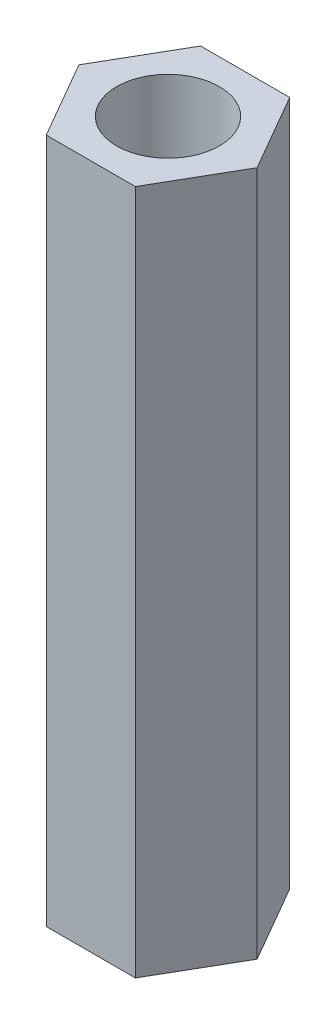
ISO-10303-21;
HEADER;
FILE_DESCRIPTION(('STEP AP214'),'2;1');
FILE_NAME('part.step','',(''),(''),'','','');
FILE_SCHEMA(('AUTOMOTIVE_DESIGN { 1 0 10303 214 1 1 1 1 }'));
ENDSEC;
DATA;
#1=APPLICATION_CONTEXT('core data for automotive mechanical design processes');
#2=APPLICATION_PROTOCOL_DEFINITION('international standard','automotive_design',2000,#1);
#3=PRODUCT_CONTEXT('',#1,'mechanical');
#4=PRODUCT('Part','Part','',(#3));
#5=PRODUCT_RELATED_PRODUCT_CATEGORY('part','',(#4));
#6=PRODUCT_DEFINITION_FORMATION('','',#4);
#7=PRODUCT_DEFINITION_CONTEXT('part definition',#1,'design');
#8=PRODUCT_DEFINITION('design','',#6,#7);
#9=PRODUCT_DEFINITION_SHAPE('','',#8);
#10=(LENGTH_UNIT() NAMED_UNIT(*) SI_UNIT(.MILLI.,.METRE.));
#11=(NAMED_UNIT(*) PLANE_ANGLE_UNIT() SI_UNIT($,.RADIAN.));
#12=(NAMED_UNIT(*) SI_UNIT($,.STERADIAN.) SOLID_ANGLE_UNIT());
#13=UNCERTAINTY_MEASURE_WITH_UNIT(LENGTH_MEASURE(1.E-05),#10,'distance_accuracy_value','');
#14=(GEOMETRIC_REPRESENTATION_CONTEXT(3) GLOBAL_UNCERTAINTY_ASSIGNED_CONTEXT((#13)) GLOBAL_UNIT_ASSIGNED_CONTEXT((#10,
#11,#12)) REPRESENTATION_CONTEXT('',''));
#15=CARTESIAN_POINT('',(0.,0.,0.));
#16=DIRECTION('',(0.,0.,1.));
#17=DIRECTION('',(1.,0.,0.));
#18=AXIS2_PLACEMENT_3D('',#15,#16,#17);
#19=CARTESIAN_POINT('',(0.,20.,0.));
#20=DIRECTION('',(0.,1.,0.));
#21=DIRECTION('',(0.,0.,1.));
#22=AXIS2_PLACEMENT_3D('',#19,#20,#21);
#23=PLANE('',#22);
#24=DIRECTION('',(0.499999999999995,0.,-0.866025403784441));
#25=VECTOR('',#24,1.);
#26=CARTESIAN_POINT('',(1.30000000000003,20.,2.25166604983953));
#27=LINE('',#26,#25);
#28=CARTESIAN_POINT('',(1.30000000000003,20.,2.25166604983953));
#29=VERTEX_POINT('',#28);
#30=CARTESIAN_POINT('',(2.6,20.,0.));
#31=VERTEX_POINT('',#30);
#32=EDGE_CURVE('E139',#29,#31,#27,.T.);
#33=ORIENTED_EDGE('',*,*,#32,.T.);
#34=DIRECTION('',(-0.500000000000001,0.,-0.866025403784438));
#35=VECTOR('',#34,1.);
#36=CARTESIAN_POINT('',(2.6,20.,0.));
#37=LINE('',#36,#35);
#38=CARTESIAN_POINT('',(1.29999999999999,20.,-2.25166604983954));
#39=VERTEX_POINT('',#38);
#40=EDGE_CURVE('E97',#31,#39,#37,.T.);
#41=ORIENTED_EDGE('',*,*,#40,.T.);
#42=DIRECTION('',(-1.,0.,0.));
#43=VECTOR('',#42,1.);
#44=CARTESIAN_POINT('',(1.29999999999999,20.,-2.25166604983954));
#45=LINE('',#44,#43);
#46=CARTESIAN_POINT('',(-1.30000000000001,20.,-2.25166604983953));
#47=VERTEX_POINT('',#46);
#48=EDGE_CURVE('E110',#39,#47,#45,.T.);
#49=ORIENTED_EDGE('',*,*,#48,.T.);
#50=DIRECTION('',(-0.499999999999995,0.,0.866025403784442));
#51=VECTOR('',#50,1.);
#52=CARTESIAN_POINT('',(-1.30000000000001,20.,-2.25166604983953));
#53=LINE('',#52,#51);
#54=CARTESIAN_POINT('',(-2.6,20.,0.));
#55=VERTEX_POINT('',#54);
#56=EDGE_CURVE('E104',#47,#55,#53,.T.);
#57=ORIENTED_EDGE('',*,*,#56,.T.);
#58=DIRECTION('',(0.500000000000007,0.,0.866025403784434));
#59=VECTOR('',#58,1.);
#60=CARTESIAN_POINT('',(-2.6,20.,0.));
#61=LINE('',#60,#59);
#62=CARTESIAN_POINT('',(-1.29999999999998,20.,2.25166604983955));
#63=VERTEX_POINT('',#62);
#64=EDGE_CURVE('E108',#55,#63,#61,.T.);
#65=ORIENTED_EDGE('',*,*,#64,.T.);
#66=DIRECTION('',(1.,0.,0.));
#67=VECTOR('',#66,1.);
#68=CARTESIAN_POINT('',(-1.29999999999998,20.,2.25166604983955));
#69=LINE('',#68,#67);
#70=EDGE_CURVE('E60',#63,#29,#69,.T.);
#71=ORIENTED_EDGE('',*,*,#70,.T.);
#72=EDGE_LOOP('',(#33,#41,#49,#57,#65,#71));
#73=FACE_BOUND('',#72,.T.);
#74=CARTESIAN_POINT('',(0.,20.,0.));
#75=DIRECTION('',(0.,1.,0.));
#76=DIRECTION('',(0.,0.,1.));
#77=AXIS2_PLACEMENT_3D('',#74,#75,#76);
#78=CIRCLE('',#77,1.5);
#79=CARTESIAN_POINT('',(0.,20.,1.5));
#80=VERTEX_POINT('',#79);
#81=EDGE_CURVE('E132',#80,#80,#78,.T.);
#82=ORIENTED_EDGE('',*,*,#81,.F.);
#83=EDGE_LOOP('',(#82));
#84=FACE_BOUND('',#83,.T.);
#85=ADVANCED_FACE('F43',(#73,#84),#23,.T.);
#86=CARTESIAN_POINT('',(0.,0.,0.));
#87=DIRECTION('',(0.,1.,0.));
#88=DIRECTION('',(0.,0.,1.));
#89=AXIS2_PLACEMENT_3D('',#86,#87,#88);
#90=PLANE('',#89);
#91=DIRECTION('',(0.499999999999995,0.,-0.866025403784441));
#92=VECTOR('',#91,1.);
#93=CARTESIAN_POINT('',(1.30000000000003,0.,2.25166604983953));
#94=LINE('',#93,#92);
#95=CARTESIAN_POINT('',(1.30000000000003,0.,2.25166604983953));
#96=VERTEX_POINT('',#95);
#97=CARTESIAN_POINT('',(2.6,0.,0.));
#98=VERTEX_POINT('',#97);
#99=EDGE_CURVE('E128',#96,#98,#94,.T.);
#100=ORIENTED_EDGE('',*,*,#99,.F.);
#101=DIRECTION('',(1.,0.,0.));
#102=VECTOR('',#101,1.);
#103=CARTESIAN_POINT('',(-1.29999999999998,0.,2.25166604983955));
#104=LINE('',#103,#102);
#105=CARTESIAN_POINT('',(-1.29999999999998,0.,2.25166604983955));
#106=VERTEX_POINT('',#105);
#107=EDGE_CURVE('E89',#106,#96,#104,.T.);
#108=ORIENTED_EDGE('',*,*,#107,.F.);
#109=DIRECTION('',(0.500000000000007,0.,0.866025403784434));
#110=VECTOR('',#109,1.);
#111=CARTESIAN_POINT('',(-2.6,0.,0.));
#112=LINE('',#111,#110);
#113=CARTESIAN_POINT('',(-2.6,0.,0.));
#114=VERTEX_POINT('',#113);
#115=EDGE_CURVE('E83',#114,#106,#112,.T.);
#116=ORIENTED_EDGE('',*,*,#115,.F.);
#117=DIRECTION('',(-0.499999999999995,0.,0.866025403784442));
#118=VECTOR('',#117,1.);
#119=CARTESIAN_POINT('',(-1.30000000000001,0.,-2.25166604983953));
#120=LINE('',#119,#118);
#121=CARTESIAN_POINT('',(-1.30000000000001,0.,-2.25166604983953));
#122=VERTEX_POINT('',#121);
#123=EDGE_CURVE('E118',#122,#114,#120,.T.);
#124=ORIENTED_EDGE('',*,*,#123,.F.);
#125=DIRECTION('',(-1.,0.,0.));
#126=VECTOR('',#125,1.);
#127=CARTESIAN_POINT('',(1.29999999999999,0.,-2.25166604983954));
#128=LINE('',#127,#126);
#129=CARTESIAN_POINT('',(1.29999999999999,0.,-2.25166604983954));
#130=VERTEX_POINT('',#129);
#131=EDGE_CURVE('E134',#130,#122,#128,.T.);
#132=ORIENTED_EDGE('',*,*,#131,.F.);
#133=DIRECTION('',(-0.500000000000001,0.,-0.866025403784438));
#134=VECTOR('',#133,1.);
#135=CARTESIAN_POINT('',(2.6,0.,0.));
#136=LINE('',#135,#134);
#137=EDGE_CURVE('E131',#98,#130,#136,.T.);
#138=ORIENTED_EDGE('',*,*,#137,.F.);
#139=EDGE_LOOP('',(#100,#108,#116,#124,#132,#138));
#140=FACE_BOUND('',#139,.T.);
#141=CARTESIAN_POINT('',(0.,0.,0.));
#142=DIRECTION('',(0.,1.,0.));
#143=DIRECTION('',(0.,0.,1.));
#144=AXIS2_PLACEMENT_3D('',#141,#142,#143);
#145=CIRCLE('',#144,1.5);
#146=CARTESIAN_POINT('',(0.,0.,1.5));
#147=VERTEX_POINT('',#146);
#148=EDGE_CURVE('E232',#147,#147,#145,.T.);
#149=ORIENTED_EDGE('',*,*,#148,.T.);
#150=EDGE_LOOP('',(#149));
#151=FACE_BOUND('',#150,.T.);
#152=ADVANCED_FACE('F148',(#140,#151),#90,.F.);
#153=CARTESIAN_POINT('',(1.30000000000003,20.,2.25166604983953));
#154=DIRECTION('',(-0.866025403784441,0.,-0.499999999999995));
#155=DIRECTION('',(-0.499999999999995,0.,0.866025403784441));
#156=AXIS2_PLACEMENT_3D('',#153,#154,#155);
#157=PLANE('',#156);
#158=ORIENTED_EDGE('',*,*,#99,.T.);
#159=DIRECTION('',(0.,-1.,0.));
#160=VECTOR('',#159,1.);
#161=CARTESIAN_POINT('',(2.6,20.,0.));
#162=LINE('',#161,#160);
#163=EDGE_CURVE('E11',#31,#98,#162,.T.);
#164=ORIENTED_EDGE('',*,*,#163,.F.);
#165=ORIENTED_EDGE('',*,*,#32,.F.);
#166=DIRECTION('',(0.,-1.,0.));
#167=VECTOR('',#166,1.);
#168=CARTESIAN_POINT('',(1.30000000000003,20.,2.25166604983953));
#169=LINE('',#168,#167);
#170=EDGE_CURVE('E124',#29,#96,#169,.T.);
#171=ORIENTED_EDGE('',*,*,#170,.T.);
#172=EDGE_LOOP('',(#158,#164,#165,#171));
#173=FACE_BOUND('',#172,.T.);
#174=ADVANCED_FACE('F45',(#173),#157,.F.);
#175=CARTESIAN_POINT('',(2.6,20.,0.));
#176=DIRECTION('',(-0.866025403784438,0.,0.500000000000001));
#177=DIRECTION('',(0.500000000000001,0.,0.866025403784438));
#178=AXIS2_PLACEMENT_3D('',#175,#176,#177);
#179=PLANE('',#178);
#180=ORIENTED_EDGE('',*,*,#137,.T.);
#181=DIRECTION('',(0.,-1.,0.));
#182=VECTOR('',#181,1.);
#183=CARTESIAN_POINT('',(1.29999999999999,20.,-2.25166604983954));
#184=LINE('',#183,#182);
#185=EDGE_CURVE('E52',#39,#130,#184,.T.);
#186=ORIENTED_EDGE('',*,*,#185,.F.);
#187=ORIENTED_EDGE('',*,*,#40,.F.);
#188=ORIENTED_EDGE('',*,*,#163,.T.);
#189=EDGE_LOOP('',(#180,#186,#187,#188));
#190=FACE_BOUND('',#189,.T.);
#191=ADVANCED_FACE('F173',(#190),#179,.F.);
#192=CARTESIAN_POINT('',(1.29999999999999,20.,-2.25166604983954));
#193=DIRECTION('',(0.,0.,1.));
#194=DIRECTION('',(1.,0.,0.));
#195=AXIS2_PLACEMENT_3D('',#192,#193,#194);
#196=PLANE('',#195);
#197=ORIENTED_EDGE('',*,*,#131,.T.);
#198=DIRECTION('',(0.,-1.,0.));
#199=VECTOR('',#198,1.);
#200=CARTESIAN_POINT('',(-1.30000000000001,20.,-2.25166604983953));
#201=LINE('',#200,#199);
#202=EDGE_CURVE('E119',#47,#122,#201,.T.);
#203=ORIENTED_EDGE('',*,*,#202,.F.);
#204=ORIENTED_EDGE('',*,*,#48,.F.);
#205=ORIENTED_EDGE('',*,*,#185,.T.);
#206=EDGE_LOOP('',(#197,#203,#204,#205));
#207=FACE_BOUND('',#206,.T.);
#208=ADVANCED_FACE('F145',(#207),#196,.F.);
#209=CARTESIAN_POINT('',(-1.30000000000001,20.,-2.25166604983953));
#210=DIRECTION('',(0.866025403784442,0.,0.499999999999995));
#211=DIRECTION('',(0.499999999999995,0.,-0.866025403784442));
#212=AXIS2_PLACEMENT_3D('',#209,#210,#211);
#213=PLANE('',#212);
#214=ORIENTED_EDGE('',*,*,#123,.T.);
#215=DIRECTION('',(0.,-1.,0.));
#216=VECTOR('',#215,1.);
#217=CARTESIAN_POINT('',(-2.6,20.,0.));
#218=LINE('',#217,#216);
#219=EDGE_CURVE('E115',#55,#114,#218,.T.);
#220=ORIENTED_EDGE('',*,*,#219,.F.);
#221=ORIENTED_EDGE('',*,*,#56,.F.);
#222=ORIENTED_EDGE('',*,*,#202,.T.);
#223=EDGE_LOOP('',(#214,#220,#221,#222));
#224=FACE_BOUND('',#223,.T.);
#225=ADVANCED_FACE('F116',(#224),#213,.F.);
#226=CARTESIAN_POINT('',(-2.6,20.,0.));
#227=DIRECTION('',(0.866025403784435,0.,-0.500000000000007));
#228=DIRECTION('',(-0.500000000000007,0.,-0.866025403784435));
#229=AXIS2_PLACEMENT_3D('',#226,#227,#228);
#230=PLANE('',#229);
#231=ORIENTED_EDGE('',*,*,#115,.T.);
#232=DIRECTION('',(0.,-1.,0.));
#233=VECTOR('',#232,1.);
#234=CARTESIAN_POINT('',(-1.29999999999998,20.,2.25166604983955));
#235=LINE('',#234,#233);
#236=EDGE_CURVE('E120',#63,#106,#235,.T.);
#237=ORIENTED_EDGE('',*,*,#236,.F.);
#238=ORIENTED_EDGE('',*,*,#64,.F.);
#239=ORIENTED_EDGE('',*,*,#219,.T.);
#240=EDGE_LOOP('',(#231,#237,#238,#239));
#241=FACE_BOUND('',#240,.T.);
#242=ADVANCED_FACE('F122',(#241),#230,.F.);
#243=CARTESIAN_POINT('',(-1.29999999999998,20.,2.25166604983955));
#244=DIRECTION('',(0.,0.,-1.));
#245=DIRECTION('',(-1.,0.,0.));
#246=AXIS2_PLACEMENT_3D('',#243,#244,#245);
#247=PLANE('',#246);
#248=ORIENTED_EDGE('',*,*,#107,.T.);
#249=ORIENTED_EDGE('',*,*,#170,.F.);
#250=ORIENTED_EDGE('',*,*,#70,.F.);
#251=ORIENTED_EDGE('',*,*,#236,.T.);
#252=EDGE_LOOP('',(#248,#249,#250,#251));
#253=FACE_BOUND('',#252,.T.);
#254=ADVANCED_FACE('F153',(#253),#247,.F.);
#255=CARTESIAN_POINT('',(0.,20.,0.));
#256=DIRECTION('',(0.,-1.,0.));
#257=DIRECTION('',(0.,0.,-1.));
#258=AXIS2_PLACEMENT_3D('',#255,#256,#257);
#259=CYLINDRICAL_SURFACE('',#258,1.5);
#260=ORIENTED_EDGE('',*,*,#81,.T.);
#261=EDGE_LOOP('',(#260));
#262=FACE_BOUND('',#261,.T.);
#263=ORIENTED_EDGE('',*,*,#148,.F.);
#264=EDGE_LOOP('',(#263));
#265=FACE_BOUND('',#264,.T.);
#266=ADVANCED_FACE('F155',(#262,#265),#259,.F.);
#267=CLOSED_SHELL('',(#85,#152,#174,#191,#208,#225,#242,#254,#266));
#268=MANIFOLD_SOLID_BREP('B2',#267);
#269=ADVANCED_BREP_SHAPE_REPRESENTATION('',(#18,#268),#14);
#270=SHAPE_DEFINITION_REPRESENTATION(#9,#269);
ENDSEC;
END-ISO-10303-21;
